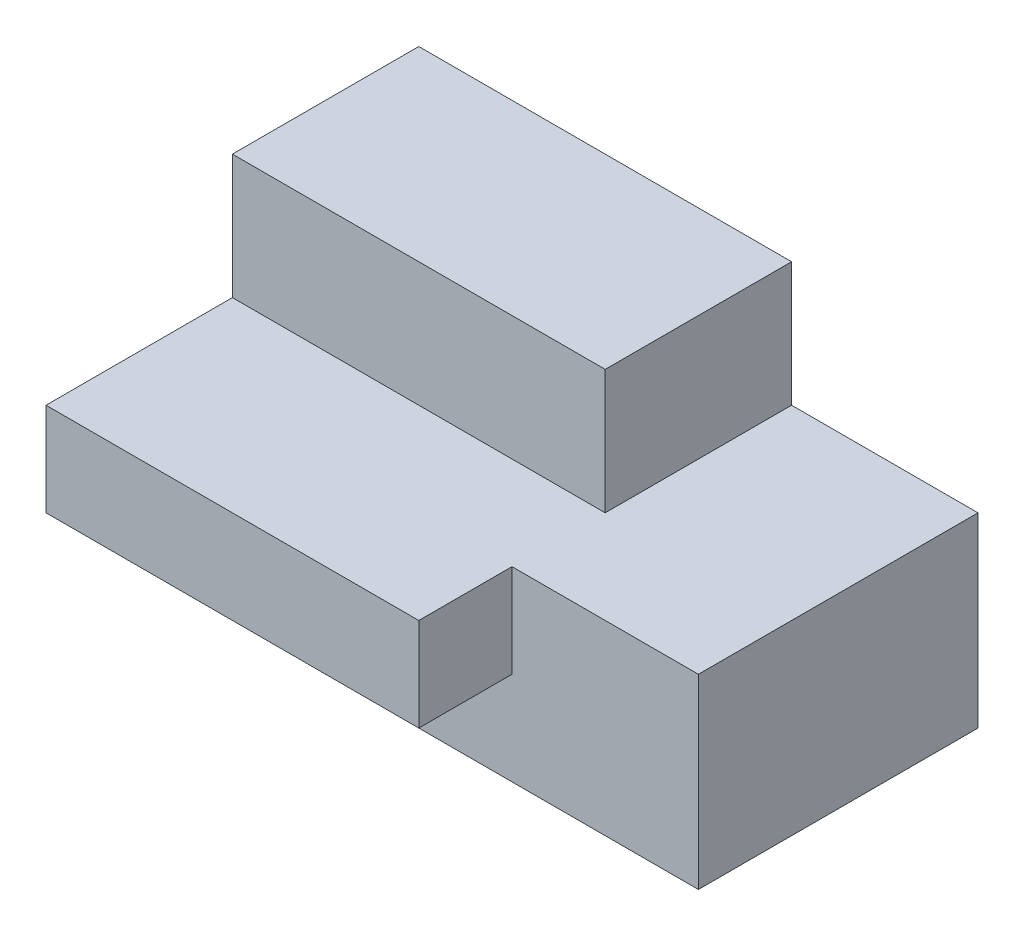
ISO-10303-21;
HEADER;
FILE_DESCRIPTION(('STEP AP214'),'2;1');
FILE_NAME('part.step','',(''),(''),'','','');
FILE_SCHEMA(('AUTOMOTIVE_DESIGN { 1 0 10303 214 1 1 1 1 }'));
ENDSEC;
DATA;
#1=APPLICATION_CONTEXT('core data for automotive mechanical design processes');
#2=APPLICATION_PROTOCOL_DEFINITION('international standard','automotive_design',2000,#1);
#3=PRODUCT_CONTEXT('',#1,'mechanical');
#4=PRODUCT('Part','Part','',(#3));
#5=PRODUCT_RELATED_PRODUCT_CATEGORY('part','',(#4));
#6=PRODUCT_DEFINITION_FORMATION('','',#4);
#7=PRODUCT_DEFINITION_CONTEXT('part definition',#1,'design');
#8=PRODUCT_DEFINITION('design','',#6,#7);
#9=PRODUCT_DEFINITION_SHAPE('','',#8);
#10=(LENGTH_UNIT() NAMED_UNIT(*) SI_UNIT(.MILLI.,.METRE.));
#11=(NAMED_UNIT(*) PLANE_ANGLE_UNIT() SI_UNIT($,.RADIAN.));
#12=(NAMED_UNIT(*) SI_UNIT($,.STERADIAN.) SOLID_ANGLE_UNIT());
#13=UNCERTAINTY_MEASURE_WITH_UNIT(LENGTH_MEASURE(1.E-05),#10,'distance_accuracy_value','');
#14=(GEOMETRIC_REPRESENTATION_CONTEXT(3) GLOBAL_UNCERTAINTY_ASSIGNED_CONTEXT((#13)) GLOBAL_UNIT_ASSIGNED_CONTEXT((#10,
#11,#12)) REPRESENTATION_CONTEXT('',''));
#15=CARTESIAN_POINT('',(0.,0.,0.));
#16=DIRECTION('',(0.,0.,1.));
#17=DIRECTION('',(1.,0.,0.));
#18=AXIS2_PLACEMENT_3D('',#15,#16,#17);
#19=CARTESIAN_POINT('',(0.,24.,-36.));
#20=DIRECTION('',(0.,-1.,0.));
#21=DIRECTION('',(0.,0.,-1.));
#22=AXIS2_PLACEMENT_3D('',#19,#20,#21);
#23=PLANE('',#22);
#24=DIRECTION('',(1.,0.,0.));
#25=VECTOR('',#24,1.);
#26=CARTESIAN_POINT('',(0.,24.,-12.));
#27=LINE('',#26,#25);
#28=CARTESIAN_POINT('',(0.,24.,-12.));
#29=VERTEX_POINT('',#28);
#30=CARTESIAN_POINT('',(48.,24.,-12.));
#31=VERTEX_POINT('',#30);
#32=EDGE_CURVE('E63',#29,#31,#27,.T.);
#33=ORIENTED_EDGE('',*,*,#32,.F.);
#34=DIRECTION('',(0.,0.,1.));
#35=VECTOR('',#34,1.);
#36=CARTESIAN_POINT('',(0.,24.,-36.));
#37=LINE('',#36,#35);
#38=CARTESIAN_POINT('',(0.,24.,12.));
#39=VERTEX_POINT('',#38);
#40=EDGE_CURVE('E179',#29,#39,#37,.T.);
#41=ORIENTED_EDGE('',*,*,#40,.T.);
#42=DIRECTION('',(1.,0.,0.));
#43=VECTOR('',#42,1.);
#44=CARTESIAN_POINT('',(0.,24.,12.));
#45=LINE('',#44,#43);
#46=CARTESIAN_POINT('',(48.,24.,12.));
#47=VERTEX_POINT('',#46);
#48=EDGE_CURVE('E224',#39,#47,#45,.T.);
#49=ORIENTED_EDGE('',*,*,#48,.T.);
#50=DIRECTION('',(0.,0.,-1.));
#51=VECTOR('',#50,1.);
#52=CARTESIAN_POINT('',(48.,24.,12.));
#53=LINE('',#52,#51);
#54=CARTESIAN_POINT('',(48.,24.,0.));
#55=VERTEX_POINT('',#54);
#56=EDGE_CURVE('E169',#47,#55,#53,.T.);
#57=ORIENTED_EDGE('',*,*,#56,.T.);
#58=DIRECTION('',(1.,0.,0.));
#59=VECTOR('',#58,1.);
#60=CARTESIAN_POINT('',(0.,24.,0.));
#61=LINE('',#60,#59);
#62=CARTESIAN_POINT('',(72.,24.,0.));
#63=VERTEX_POINT('',#62);
#64=EDGE_CURVE('E168',#55,#63,#61,.T.);
#65=ORIENTED_EDGE('',*,*,#64,.T.);
#66=DIRECTION('',(0.,0.,1.));
#67=VECTOR('',#66,1.);
#68=CARTESIAN_POINT('',(72.,24.,-36.));
#69=LINE('',#68,#67);
#70=CARTESIAN_POINT('',(72.,24.,-36.));
#71=VERTEX_POINT('',#70);
#72=EDGE_CURVE('E49',#71,#63,#69,.T.);
#73=ORIENTED_EDGE('',*,*,#72,.F.);
#74=DIRECTION('',(1.,0.,0.));
#75=VECTOR('',#74,1.);
#76=CARTESIAN_POINT('',(0.,24.,-36.));
#77=LINE('',#76,#75);
#78=CARTESIAN_POINT('',(48.,24.,-36.));
#79=VERTEX_POINT('',#78);
#80=EDGE_CURVE('E140',#79,#71,#77,.T.);
#81=ORIENTED_EDGE('',*,*,#80,.F.);
#82=DIRECTION('',(0.,0.,1.));
#83=VECTOR('',#82,1.);
#84=CARTESIAN_POINT('',(48.,24.,-36.));
#85=LINE('',#84,#83);
#86=EDGE_CURVE('E126',#79,#31,#85,.T.);
#87=ORIENTED_EDGE('',*,*,#86,.T.);
#88=EDGE_LOOP('',(#33,#41,#49,#57,#65,#73,#81,#87));
#89=FACE_BOUND('',#88,.T.);
#90=ADVANCED_FACE('F45',(#89),#23,.F.);
#91=CARTESIAN_POINT('',(0.,0.,0.));
#92=DIRECTION('',(0.,0.,1.));
#93=DIRECTION('',(1.,0.,0.));
#94=AXIS2_PLACEMENT_3D('',#91,#92,#93);
#95=PLANE('',#94);
#96=ORIENTED_EDGE('',*,*,#64,.F.);
#97=DIRECTION('',(0.,-1.,0.));
#98=VECTOR('',#97,1.);
#99=CARTESIAN_POINT('',(48.,0.,0.));
#100=LINE('',#99,#98);
#101=CARTESIAN_POINT('',(48.,12.,0.));
#102=VERTEX_POINT('',#101);
#103=EDGE_CURVE('E203',#55,#102,#100,.T.);
#104=ORIENTED_EDGE('',*,*,#103,.T.);
#105=DIRECTION('',(1.,0.,0.));
#106=VECTOR('',#105,1.);
#107=CARTESIAN_POINT('',(0.,12.,0.));
#108=LINE('',#107,#106);
#109=CARTESIAN_POINT('',(0.,12.,0.));
#110=VERTEX_POINT('',#109);
#111=EDGE_CURVE('E71',#110,#102,#108,.T.);
#112=ORIENTED_EDGE('',*,*,#111,.F.);
#113=DIRECTION('',(0.,1.,0.));
#114=VECTOR('',#113,1.);
#115=CARTESIAN_POINT('',(0.,0.,0.));
#116=LINE('',#115,#114);
#117=CARTESIAN_POINT('',(0.,0.,0.));
#118=VERTEX_POINT('',#117);
#119=EDGE_CURVE('E172',#118,#110,#116,.T.);
#120=ORIENTED_EDGE('',*,*,#119,.F.);
#121=DIRECTION('',(1.,0.,0.));
#122=VECTOR('',#121,1.);
#123=CARTESIAN_POINT('',(0.,0.,0.));
#124=LINE('',#123,#122);
#125=CARTESIAN_POINT('',(72.,0.,0.));
#126=VERTEX_POINT('',#125);
#127=EDGE_CURVE('E157',#118,#126,#124,.T.);
#128=ORIENTED_EDGE('',*,*,#127,.T.);
#129=DIRECTION('',(0.,1.,0.));
#130=VECTOR('',#129,1.);
#131=CARTESIAN_POINT('',(72.,0.,0.));
#132=LINE('',#131,#130);
#133=EDGE_CURVE('E164',#126,#63,#132,.T.);
#134=ORIENTED_EDGE('',*,*,#133,.T.);
#135=EDGE_LOOP('',(#96,#104,#112,#120,#128,#134));
#136=FACE_BOUND('',#135,.T.);
#137=ADVANCED_FACE('F187',(#136),#95,.T.);
#138=CARTESIAN_POINT('',(72.,0.,-36.));
#139=DIRECTION('',(1.,0.,0.));
#140=DIRECTION('',(0.,0.,-1.));
#141=AXIS2_PLACEMENT_3D('',#138,#139,#140);
#142=PLANE('',#141);
#143=ORIENTED_EDGE('',*,*,#133,.F.);
#144=DIRECTION('',(0.,0.,1.));
#145=VECTOR('',#144,1.);
#146=CARTESIAN_POINT('',(72.,0.,-36.));
#147=LINE('',#146,#145);
#148=CARTESIAN_POINT('',(72.,0.,-36.));
#149=VERTEX_POINT('',#148);
#150=EDGE_CURVE('E11',#149,#126,#147,.T.);
#151=ORIENTED_EDGE('',*,*,#150,.F.);
#152=DIRECTION('',(0.,1.,0.));
#153=VECTOR('',#152,1.);
#154=CARTESIAN_POINT('',(72.,0.,-36.));
#155=LINE('',#154,#153);
#156=EDGE_CURVE('E151',#149,#71,#155,.T.);
#157=ORIENTED_EDGE('',*,*,#156,.T.);
#158=ORIENTED_EDGE('',*,*,#72,.T.);
#159=EDGE_LOOP('',(#143,#151,#157,#158));
#160=FACE_BOUND('',#159,.T.);
#161=ADVANCED_FACE('F47',(#160),#142,.T.);
#162=CARTESIAN_POINT('',(0.,0.,-36.));
#163=DIRECTION('',(0.,-1.,0.));
#164=DIRECTION('',(0.,0.,-1.));
#165=AXIS2_PLACEMENT_3D('',#162,#163,#164);
#166=PLANE('',#165);
#167=ORIENTED_EDGE('',*,*,#127,.F.);
#168=DIRECTION('',(0.,0.,1.));
#169=VECTOR('',#168,1.);
#170=CARTESIAN_POINT('',(0.,0.,-36.));
#171=LINE('',#170,#169);
#172=CARTESIAN_POINT('',(0.,0.,-36.));
#173=VERTEX_POINT('',#172);
#174=EDGE_CURVE('E55',#173,#118,#171,.T.);
#175=ORIENTED_EDGE('',*,*,#174,.F.);
#176=DIRECTION('',(1.,0.,0.));
#177=VECTOR('',#176,1.);
#178=CARTESIAN_POINT('',(0.,0.,-36.));
#179=LINE('',#178,#177);
#180=EDGE_CURVE('E155',#173,#149,#179,.T.);
#181=ORIENTED_EDGE('',*,*,#180,.T.);
#182=ORIENTED_EDGE('',*,*,#150,.T.);
#183=EDGE_LOOP('',(#167,#175,#181,#182));
#184=FACE_BOUND('',#183,.T.);
#185=ADVANCED_FACE('F191',(#184),#166,.T.);
#186=CARTESIAN_POINT('',(0.,0.,-36.));
#187=DIRECTION('',(1.,0.,0.));
#188=DIRECTION('',(0.,0.,-1.));
#189=AXIS2_PLACEMENT_3D('',#186,#187,#188);
#190=PLANE('',#189);
#191=ORIENTED_EDGE('',*,*,#119,.T.);
#192=DIRECTION('',(0.,0.,-1.));
#193=VECTOR('',#192,1.);
#194=CARTESIAN_POINT('',(0.,12.,12.));
#195=LINE('',#194,#193);
#196=CARTESIAN_POINT('',(0.,12.,12.));
#197=VERTEX_POINT('',#196);
#198=EDGE_CURVE('E242',#197,#110,#195,.T.);
#199=ORIENTED_EDGE('',*,*,#198,.F.);
#200=DIRECTION('',(0.,1.,0.));
#201=VECTOR('',#200,1.);
#202=CARTESIAN_POINT('',(0.,0.,12.));
#203=LINE('',#202,#201);
#204=EDGE_CURVE('E227',#197,#39,#203,.T.);
#205=ORIENTED_EDGE('',*,*,#204,.T.);
#206=ORIENTED_EDGE('',*,*,#40,.F.);
#207=DIRECTION('',(0.,1.,0.));
#208=VECTOR('',#207,1.);
#209=CARTESIAN_POINT('',(0.,0.,-12.));
#210=LINE('',#209,#208);
#211=CARTESIAN_POINT('',(0.,40.,-12.));
#212=VERTEX_POINT('',#211);
#213=EDGE_CURVE('E145',#29,#212,#210,.T.);
#214=ORIENTED_EDGE('',*,*,#213,.T.);
#215=DIRECTION('',(0.,0.,1.));
#216=VECTOR('',#215,1.);
#217=CARTESIAN_POINT('',(0.,40.,-36.));
#218=LINE('',#217,#216);
#219=CARTESIAN_POINT('',(0.,40.,-36.));
#220=VERTEX_POINT('',#219);
#221=EDGE_CURVE('E197',#220,#212,#218,.T.);
#222=ORIENTED_EDGE('',*,*,#221,.F.);
#223=DIRECTION('',(0.,1.,0.));
#224=VECTOR('',#223,1.);
#225=CARTESIAN_POINT('',(0.,0.,-36.));
#226=LINE('',#225,#224);
#227=EDGE_CURVE('E150',#173,#220,#226,.T.);
#228=ORIENTED_EDGE('',*,*,#227,.F.);
#229=ORIENTED_EDGE('',*,*,#174,.T.);
#230=EDGE_LOOP('',(#191,#199,#205,#206,#214,#222,#228,#229));
#231=FACE_BOUND('',#230,.T.);
#232=ADVANCED_FACE('F198',(#231),#190,.F.);
#233=CARTESIAN_POINT('',(0.,0.,-36.));
#234=DIRECTION('',(0.,0.,1.));
#235=DIRECTION('',(1.,0.,0.));
#236=AXIS2_PLACEMENT_3D('',#233,#234,#235);
#237=PLANE('',#236);
#238=ORIENTED_EDGE('',*,*,#156,.F.);
#239=ORIENTED_EDGE('',*,*,#180,.F.);
#240=ORIENTED_EDGE('',*,*,#227,.T.);
#241=DIRECTION('',(1.,0.,0.));
#242=VECTOR('',#241,1.);
#243=CARTESIAN_POINT('',(0.,40.,-36.));
#244=LINE('',#243,#242);
#245=CARTESIAN_POINT('',(48.,40.,-36.));
#246=VERTEX_POINT('',#245);
#247=EDGE_CURVE('E135',#220,#246,#244,.T.);
#248=ORIENTED_EDGE('',*,*,#247,.T.);
#249=DIRECTION('',(0.,1.,0.));
#250=VECTOR('',#249,1.);
#251=CARTESIAN_POINT('',(48.,0.,-36.));
#252=LINE('',#251,#250);
#253=EDGE_CURVE('E129',#79,#246,#252,.T.);
#254=ORIENTED_EDGE('',*,*,#253,.F.);
#255=ORIENTED_EDGE('',*,*,#80,.T.);
#256=EDGE_LOOP('',(#238,#239,#240,#248,#254,#255));
#257=FACE_BOUND('',#256,.T.);
#258=ADVANCED_FACE('F139',(#257),#237,.F.);
#259=CARTESIAN_POINT('',(48.,0.,12.));
#260=DIRECTION('',(1.,0.,0.));
#261=DIRECTION('',(0.,0.,-1.));
#262=AXIS2_PLACEMENT_3D('',#259,#260,#261);
#263=PLANE('',#262);
#264=ORIENTED_EDGE('',*,*,#103,.F.);
#265=ORIENTED_EDGE('',*,*,#56,.F.);
#266=DIRECTION('',(0.,-1.,0.));
#267=VECTOR('',#266,1.);
#268=CARTESIAN_POINT('',(48.,0.,12.));
#269=LINE('',#268,#267);
#270=CARTESIAN_POINT('',(48.,12.,12.));
#271=VERTEX_POINT('',#270);
#272=EDGE_CURVE('E220',#47,#271,#269,.T.);
#273=ORIENTED_EDGE('',*,*,#272,.T.);
#274=DIRECTION('',(0.,0.,-1.));
#275=VECTOR('',#274,1.);
#276=CARTESIAN_POINT('',(48.,12.,12.));
#277=LINE('',#276,#275);
#278=EDGE_CURVE('E234',#271,#102,#277,.T.);
#279=ORIENTED_EDGE('',*,*,#278,.T.);
#280=EDGE_LOOP('',(#264,#265,#273,#279));
#281=FACE_BOUND('',#280,.T.);
#282=ADVANCED_FACE('F249',(#281),#263,.T.);
#283=CARTESIAN_POINT('',(0.,12.,12.));
#284=DIRECTION('',(0.,1.,0.));
#285=DIRECTION('',(0.,0.,1.));
#286=AXIS2_PLACEMENT_3D('',#283,#284,#285);
#287=PLANE('',#286);
#288=ORIENTED_EDGE('',*,*,#111,.T.);
#289=ORIENTED_EDGE('',*,*,#278,.F.);
#290=DIRECTION('',(1.,0.,0.));
#291=VECTOR('',#290,1.);
#292=CARTESIAN_POINT('',(0.,12.,12.));
#293=LINE('',#292,#291);
#294=EDGE_CURVE('E231',#197,#271,#293,.T.);
#295=ORIENTED_EDGE('',*,*,#294,.F.);
#296=ORIENTED_EDGE('',*,*,#198,.T.);
#297=EDGE_LOOP('',(#288,#289,#295,#296));
#298=FACE_BOUND('',#297,.T.);
#299=ADVANCED_FACE('F253',(#298),#287,.F.);
#300=CARTESIAN_POINT('',(0.,0.,12.));
#301=DIRECTION('',(0.,0.,1.));
#302=DIRECTION('',(1.,0.,0.));
#303=AXIS2_PLACEMENT_3D('',#300,#301,#302);
#304=PLANE('',#303);
#305=ORIENTED_EDGE('',*,*,#272,.F.);
#306=ORIENTED_EDGE('',*,*,#48,.F.);
#307=ORIENTED_EDGE('',*,*,#204,.F.);
#308=ORIENTED_EDGE('',*,*,#294,.T.);
#309=EDGE_LOOP('',(#305,#306,#307,#308));
#310=FACE_BOUND('',#309,.T.);
#311=ADVANCED_FACE('F256',(#310),#304,.T.);
#312=CARTESIAN_POINT('',(0.,40.,-36.));
#313=DIRECTION('',(0.,-1.,0.));
#314=DIRECTION('',(0.,0.,-1.));
#315=AXIS2_PLACEMENT_3D('',#312,#313,#314);
#316=PLANE('',#315);
#317=DIRECTION('',(1.,0.,0.));
#318=VECTOR('',#317,1.);
#319=CARTESIAN_POINT('',(0.,40.,-12.));
#320=LINE('',#319,#318);
#321=CARTESIAN_POINT('',(48.,40.,-12.));
#322=VERTEX_POINT('',#321);
#323=EDGE_CURVE('E213',#212,#322,#320,.T.);
#324=ORIENTED_EDGE('',*,*,#323,.T.);
#325=DIRECTION('',(0.,0.,1.));
#326=VECTOR('',#325,1.);
#327=CARTESIAN_POINT('',(48.,40.,-36.));
#328=LINE('',#327,#326);
#329=EDGE_CURVE('E134',#246,#322,#328,.T.);
#330=ORIENTED_EDGE('',*,*,#329,.F.);
#331=ORIENTED_EDGE('',*,*,#247,.F.);
#332=ORIENTED_EDGE('',*,*,#221,.T.);
#333=EDGE_LOOP('',(#324,#330,#331,#332));
#334=FACE_BOUND('',#333,.T.);
#335=ADVANCED_FACE('F205',(#334),#316,.F.);
#336=CARTESIAN_POINT('',(48.,0.,-36.));
#337=DIRECTION('',(1.,0.,0.));
#338=DIRECTION('',(0.,0.,-1.));
#339=AXIS2_PLACEMENT_3D('',#336,#337,#338);
#340=PLANE('',#339);
#341=DIRECTION('',(0.,1.,0.));
#342=VECTOR('',#341,1.);
#343=CARTESIAN_POINT('',(48.,0.,-12.));
#344=LINE('',#343,#342);
#345=EDGE_CURVE('E130',#31,#322,#344,.T.);
#346=ORIENTED_EDGE('',*,*,#345,.F.);
#347=ORIENTED_EDGE('',*,*,#86,.F.);
#348=ORIENTED_EDGE('',*,*,#253,.T.);
#349=ORIENTED_EDGE('',*,*,#329,.T.);
#350=EDGE_LOOP('',(#346,#347,#348,#349));
#351=FACE_BOUND('',#350,.T.);
#352=ADVANCED_FACE('F128',(#351),#340,.T.);
#353=CARTESIAN_POINT('',(0.,0.,-12.));
#354=DIRECTION('',(0.,0.,1.));
#355=DIRECTION('',(1.,0.,0.));
#356=AXIS2_PLACEMENT_3D('',#353,#354,#355);
#357=PLANE('',#356);
#358=ORIENTED_EDGE('',*,*,#32,.T.);
#359=ORIENTED_EDGE('',*,*,#345,.T.);
#360=ORIENTED_EDGE('',*,*,#323,.F.);
#361=ORIENTED_EDGE('',*,*,#213,.F.);
#362=EDGE_LOOP('',(#358,#359,#360,#361));
#363=FACE_BOUND('',#362,.T.);
#364=ADVANCED_FACE('F327',(#363),#357,.T.);
#365=CLOSED_SHELL('',(#90,#137,#161,#185,#232,#258,#282,#299,#311,#335,#352,#364));
#366=MANIFOLD_SOLID_BREP('B2',#365);
#367=ADVANCED_BREP_SHAPE_REPRESENTATION('',(#18,#366),#14);
#368=SHAPE_DEFINITION_REPRESENTATION(#9,#367);
ENDSEC;
END-ISO-10303-21;
